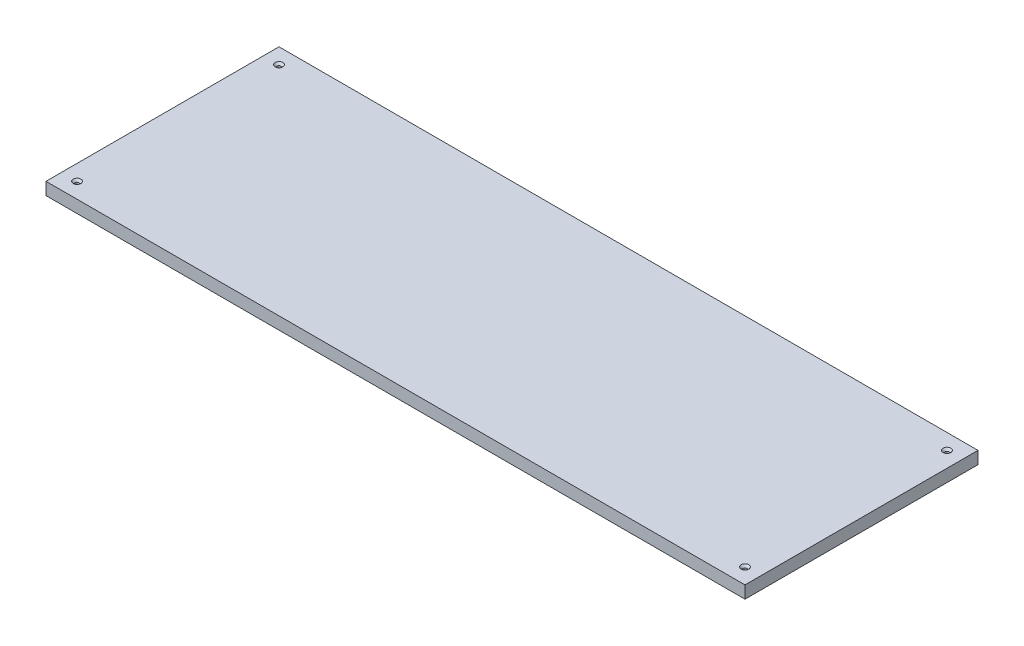
ISO-10303-21;
HEADER;
FILE_DESCRIPTION(('STEP AP214'),'2;1');
FILE_NAME('part.step','',(''),(''),'','','');
FILE_SCHEMA(('AUTOMOTIVE_DESIGN { 1 0 10303 214 1 1 1 1 }'));
ENDSEC;
DATA;
#1=APPLICATION_CONTEXT('core data for automotive mechanical design processes');
#2=APPLICATION_PROTOCOL_DEFINITION('international standard','automotive_design',2000,#1);
#3=PRODUCT_CONTEXT('',#1,'mechanical');
#4=PRODUCT('Part','Part','',(#3));
#5=PRODUCT_RELATED_PRODUCT_CATEGORY('part','',(#4));
#6=PRODUCT_DEFINITION_FORMATION('','',#4);
#7=PRODUCT_DEFINITION_CONTEXT('part definition',#1,'design');
#8=PRODUCT_DEFINITION('design','',#6,#7);
#9=PRODUCT_DEFINITION_SHAPE('','',#8);
#10=(LENGTH_UNIT() NAMED_UNIT(*) SI_UNIT(.MILLI.,.METRE.));
#11=(NAMED_UNIT(*) PLANE_ANGLE_UNIT() SI_UNIT($,.RADIAN.));
#12=(NAMED_UNIT(*) SI_UNIT($,.STERADIAN.) SOLID_ANGLE_UNIT());
#13=UNCERTAINTY_MEASURE_WITH_UNIT(LENGTH_MEASURE(1.E-05),#10,'distance_accuracy_value','');
#14=(GEOMETRIC_REPRESENTATION_CONTEXT(3) GLOBAL_UNCERTAINTY_ASSIGNED_CONTEXT((#13)) GLOBAL_UNIT_ASSIGNED_CONTEXT((#10,
#11,#12)) REPRESENTATION_CONTEXT('',''));
#15=CARTESIAN_POINT('',(0.,0.,0.));
#16=DIRECTION('',(0.,0.,1.));
#17=DIRECTION('',(1.,0.,0.));
#18=AXIS2_PLACEMENT_3D('',#15,#16,#17);
#19=CARTESIAN_POINT('',(450.,16.,150.));
#20=DIRECTION('',(-1.,0.,0.));
#21=DIRECTION('',(0.,0.,1.));
#22=AXIS2_PLACEMENT_3D('',#19,#20,#21);
#23=PLANE('',#22);
#24=DIRECTION('',(0.,0.,-1.));
#25=VECTOR('',#24,1.);
#26=CARTESIAN_POINT('',(450.,0.,150.));
#27=LINE('',#26,#25);
#28=CARTESIAN_POINT('',(450.,0.,150.));
#29=VERTEX_POINT('',#28);
#30=CARTESIAN_POINT('',(450.,0.,-150.));
#31=VERTEX_POINT('',#30);
#32=EDGE_CURVE('E104',#29,#31,#27,.T.);
#33=ORIENTED_EDGE('',*,*,#32,.T.);
#34=DIRECTION('',(0.,-1.,0.));
#35=VECTOR('',#34,1.);
#36=CARTESIAN_POINT('',(450.,16.,-150.));
#37=LINE('',#36,#35);
#38=CARTESIAN_POINT('',(450.,16.,-150.));
#39=VERTEX_POINT('',#38);
#40=EDGE_CURVE('E11',#39,#31,#37,.T.);
#41=ORIENTED_EDGE('',*,*,#40,.F.);
#42=DIRECTION('',(0.,0.,-1.));
#43=VECTOR('',#42,1.);
#44=CARTESIAN_POINT('',(450.,16.,150.));
#45=LINE('',#44,#43);
#46=CARTESIAN_POINT('',(450.,16.,150.));
#47=VERTEX_POINT('',#46);
#48=EDGE_CURVE('E92',#47,#39,#45,.T.);
#49=ORIENTED_EDGE('',*,*,#48,.F.);
#50=DIRECTION('',(0.,-1.,0.));
#51=VECTOR('',#50,1.);
#52=CARTESIAN_POINT('',(450.,16.,150.));
#53=LINE('',#52,#51);
#54=EDGE_CURVE('E100',#47,#29,#53,.T.);
#55=ORIENTED_EDGE('',*,*,#54,.T.);
#56=EDGE_LOOP('',(#33,#41,#49,#55));
#57=FACE_BOUND('',#56,.T.);
#58=ADVANCED_FACE('F41',(#57),#23,.F.);
#59=CARTESIAN_POINT('',(-450.,16.,-150.));
#60=DIRECTION('',(0.,0.,1.));
#61=DIRECTION('',(1.,0.,0.));
#62=AXIS2_PLACEMENT_3D('',#59,#60,#61);
#63=PLANE('',#62);
#64=DIRECTION('',(-1.,0.,0.));
#65=VECTOR('',#64,1.);
#66=CARTESIAN_POINT('',(-450.,0.,-150.));
#67=LINE('',#66,#65);
#68=CARTESIAN_POINT('',(-450.,0.,-150.));
#69=VERTEX_POINT('',#68);
#70=EDGE_CURVE('E96',#31,#69,#67,.T.);
#71=ORIENTED_EDGE('',*,*,#70,.T.);
#72=DIRECTION('',(0.,-1.,0.));
#73=VECTOR('',#72,1.);
#74=CARTESIAN_POINT('',(-450.,16.,-150.));
#75=LINE('',#74,#73);
#76=CARTESIAN_POINT('',(-450.,16.,-150.));
#77=VERTEX_POINT('',#76);
#78=EDGE_CURVE('E49',#77,#69,#75,.T.);
#79=ORIENTED_EDGE('',*,*,#78,.F.);
#80=DIRECTION('',(-1.,0.,0.));
#81=VECTOR('',#80,1.);
#82=CARTESIAN_POINT('',(-450.,16.,-150.));
#83=LINE('',#82,#81);
#84=EDGE_CURVE('E87',#39,#77,#83,.T.);
#85=ORIENTED_EDGE('',*,*,#84,.F.);
#86=ORIENTED_EDGE('',*,*,#40,.T.);
#87=EDGE_LOOP('',(#71,#79,#85,#86));
#88=FACE_BOUND('',#87,.T.);
#89=ADVANCED_FACE('F95',(#88),#63,.F.);
#90=CARTESIAN_POINT('',(-450.,16.,150.));
#91=DIRECTION('',(1.,0.,0.));
#92=DIRECTION('',(0.,0.,-1.));
#93=AXIS2_PLACEMENT_3D('',#90,#91,#92);
#94=PLANE('',#93);
#95=DIRECTION('',(0.,0.,1.));
#96=VECTOR('',#95,1.);
#97=CARTESIAN_POINT('',(-450.,0.,150.));
#98=LINE('',#97,#96);
#99=CARTESIAN_POINT('',(-450.,0.,150.));
#100=VERTEX_POINT('',#99);
#101=EDGE_CURVE('E74',#69,#100,#98,.T.);
#102=ORIENTED_EDGE('',*,*,#101,.T.);
#103=DIRECTION('',(0.,-1.,0.));
#104=VECTOR('',#103,1.);
#105=CARTESIAN_POINT('',(-450.,16.,150.));
#106=LINE('',#105,#104);
#107=CARTESIAN_POINT('',(-450.,16.,150.));
#108=VERTEX_POINT('',#107);
#109=EDGE_CURVE('E97',#108,#100,#106,.T.);
#110=ORIENTED_EDGE('',*,*,#109,.F.);
#111=DIRECTION('',(0.,0.,1.));
#112=VECTOR('',#111,1.);
#113=CARTESIAN_POINT('',(-450.,16.,150.));
#114=LINE('',#113,#112);
#115=EDGE_CURVE('E90',#77,#108,#114,.T.);
#116=ORIENTED_EDGE('',*,*,#115,.F.);
#117=ORIENTED_EDGE('',*,*,#78,.T.);
#118=EDGE_LOOP('',(#102,#110,#116,#117));
#119=FACE_BOUND('',#118,.T.);
#120=ADVANCED_FACE('F98',(#119),#94,.F.);
#121=CARTESIAN_POINT('',(-450.,16.,150.));
#122=DIRECTION('',(0.,0.,-1.));
#123=DIRECTION('',(-1.,0.,0.));
#124=AXIS2_PLACEMENT_3D('',#121,#122,#123);
#125=PLANE('',#124);
#126=DIRECTION('',(1.,0.,0.));
#127=VECTOR('',#126,1.);
#128=CARTESIAN_POINT('',(-450.,0.,150.));
#129=LINE('',#128,#127);
#130=EDGE_CURVE('E80',#100,#29,#129,.T.);
#131=ORIENTED_EDGE('',*,*,#130,.T.);
#132=ORIENTED_EDGE('',*,*,#54,.F.);
#133=DIRECTION('',(1.,0.,0.));
#134=VECTOR('',#133,1.);
#135=CARTESIAN_POINT('',(-450.,16.,150.));
#136=LINE('',#135,#134);
#137=EDGE_CURVE('E57',#108,#47,#136,.T.);
#138=ORIENTED_EDGE('',*,*,#137,.F.);
#139=ORIENTED_EDGE('',*,*,#109,.T.);
#140=EDGE_LOOP('',(#131,#132,#138,#139));
#141=FACE_BOUND('',#140,.T.);
#142=ADVANCED_FACE('F112',(#141),#125,.F.);
#143=CARTESIAN_POINT('',(0.,16.,0.));
#144=DIRECTION('',(0.,-1.,0.));
#145=DIRECTION('',(0.,0.,-1.));
#146=AXIS2_PLACEMENT_3D('',#143,#144,#145);
#147=PLANE('',#146);
#148=CARTESIAN_POINT('',(430.,16.,130.));
#149=DIRECTION('',(0.,1.,0.));
#150=DIRECTION('',(0.,0.,1.));
#151=AXIS2_PLACEMENT_3D('',#148,#149,#150);
#152=CIRCLE('',#151,4.95000000000001);
#153=CARTESIAN_POINT('',(430.,16.,134.95));
#154=VERTEX_POINT('',#153);
#155=EDGE_CURVE('E150',#154,#154,#152,.T.);
#156=ORIENTED_EDGE('',*,*,#155,.F.);
#157=EDGE_LOOP('',(#156));
#158=FACE_BOUND('',#157,.T.);
#159=CARTESIAN_POINT('',(430.,16.,-130.));
#160=DIRECTION('',(0.,1.,0.));
#161=DIRECTION('',(0.,0.,1.));
#162=AXIS2_PLACEMENT_3D('',#159,#160,#161);
#163=CIRCLE('',#162,4.95000000000001);
#164=CARTESIAN_POINT('',(430.,16.,-125.05));
#165=VERTEX_POINT('',#164);
#166=EDGE_CURVE('E141',#165,#165,#163,.T.);
#167=ORIENTED_EDGE('',*,*,#166,.F.);
#168=EDGE_LOOP('',(#167));
#169=FACE_BOUND('',#168,.T.);
#170=CARTESIAN_POINT('',(-430.,16.,130.));
#171=DIRECTION('',(0.,1.,0.));
#172=DIRECTION('',(0.,0.,1.));
#173=AXIS2_PLACEMENT_3D('',#170,#171,#172);
#174=CIRCLE('',#173,4.95000000000001);
#175=CARTESIAN_POINT('',(-430.,16.,134.95));
#176=VERTEX_POINT('',#175);
#177=EDGE_CURVE('E132',#176,#176,#174,.T.);
#178=ORIENTED_EDGE('',*,*,#177,.F.);
#179=EDGE_LOOP('',(#178));
#180=FACE_BOUND('',#179,.T.);
#181=CARTESIAN_POINT('',(-430.,16.,-130.));
#182=DIRECTION('',(0.,1.,0.));
#183=DIRECTION('',(0.,0.,1.));
#184=AXIS2_PLACEMENT_3D('',#181,#182,#183);
#185=CIRCLE('',#184,4.95000000000001);
#186=CARTESIAN_POINT('',(-430.,16.,-125.05));
#187=VERTEX_POINT('',#186);
#188=EDGE_CURVE('E123',#187,#187,#185,.T.);
#189=ORIENTED_EDGE('',*,*,#188,.F.);
#190=EDGE_LOOP('',(#189));
#191=FACE_BOUND('',#190,.T.);
#192=ORIENTED_EDGE('',*,*,#48,.T.);
#193=ORIENTED_EDGE('',*,*,#84,.T.);
#194=ORIENTED_EDGE('',*,*,#115,.T.);
#195=ORIENTED_EDGE('',*,*,#137,.T.);
#196=EDGE_LOOP('',(#192,#193,#194,#195));
#197=FACE_BOUND('',#196,.T.);
#198=ADVANCED_FACE('F88',(#158,#169,#180,#191,#197),#147,.F.);
#199=CARTESIAN_POINT('',(0.,0.,0.));
#200=DIRECTION('',(0.,-1.,0.));
#201=DIRECTION('',(0.,0.,-1.));
#202=AXIS2_PLACEMENT_3D('',#199,#200,#201);
#203=PLANE('',#202);
#204=CARTESIAN_POINT('',(430.,0.,130.));
#205=DIRECTION('',(0.,1.,0.));
#206=DIRECTION('',(0.,0.,1.));
#207=AXIS2_PLACEMENT_3D('',#204,#205,#206);
#208=CIRCLE('',#207,2.24999999999997);
#209=CARTESIAN_POINT('',(430.,0.,132.25));
#210=VERTEX_POINT('',#209);
#211=EDGE_CURVE('E144',#210,#210,#208,.T.);
#212=ORIENTED_EDGE('',*,*,#211,.T.);
#213=EDGE_LOOP('',(#212));
#214=FACE_BOUND('',#213,.T.);
#215=CARTESIAN_POINT('',(430.,0.,-130.));
#216=DIRECTION('',(0.,1.,0.));
#217=DIRECTION('',(0.,0.,1.));
#218=AXIS2_PLACEMENT_3D('',#215,#216,#217);
#219=CIRCLE('',#218,2.24999999999997);
#220=CARTESIAN_POINT('',(430.,0.,-127.75));
#221=VERTEX_POINT('',#220);
#222=EDGE_CURVE('E135',#221,#221,#219,.T.);
#223=ORIENTED_EDGE('',*,*,#222,.T.);
#224=EDGE_LOOP('',(#223));
#225=FACE_BOUND('',#224,.T.);
#226=CARTESIAN_POINT('',(-430.,0.,130.));
#227=DIRECTION('',(0.,1.,0.));
#228=DIRECTION('',(0.,0.,1.));
#229=AXIS2_PLACEMENT_3D('',#226,#227,#228);
#230=CIRCLE('',#229,2.24999999999997);
#231=CARTESIAN_POINT('',(-430.,0.,132.25));
#232=VERTEX_POINT('',#231);
#233=EDGE_CURVE('E126',#232,#232,#230,.T.);
#234=ORIENTED_EDGE('',*,*,#233,.T.);
#235=EDGE_LOOP('',(#234));
#236=FACE_BOUND('',#235,.T.);
#237=CARTESIAN_POINT('',(-430.,0.,-130.));
#238=DIRECTION('',(0.,1.,0.));
#239=DIRECTION('',(0.,0.,1.));
#240=AXIS2_PLACEMENT_3D('',#237,#238,#239);
#241=CIRCLE('',#240,2.24999999999997);
#242=CARTESIAN_POINT('',(-430.,0.,-127.75));
#243=VERTEX_POINT('',#242);
#244=EDGE_CURVE('E107',#243,#243,#241,.T.);
#245=ORIENTED_EDGE('',*,*,#244,.T.);
#246=EDGE_LOOP('',(#245));
#247=FACE_BOUND('',#246,.T.);
#248=ORIENTED_EDGE('',*,*,#32,.F.);
#249=ORIENTED_EDGE('',*,*,#130,.F.);
#250=ORIENTED_EDGE('',*,*,#101,.F.);
#251=ORIENTED_EDGE('',*,*,#70,.F.);
#252=EDGE_LOOP('',(#248,#249,#250,#251));
#253=FACE_BOUND('',#252,.T.);
#254=ADVANCED_FACE('F115',(#214,#225,#236,#247,#253),#203,.T.);
#255=CARTESIAN_POINT('',(-430.,16.,-130.));
#256=DIRECTION('',(0.,1.,0.));
#257=DIRECTION('',(0.,0.,1.));
#258=AXIS2_PLACEMENT_3D('',#255,#256,#257);
#259=CYLINDRICAL_SURFACE('',#258,2.24999999999997);
#260=ORIENTED_EDGE('',*,*,#244,.F.);
#261=EDGE_LOOP('',(#260));
#262=FACE_BOUND('',#261,.T.);
#263=CARTESIAN_POINT('',(-430.,13.3926403080209,-130.));
#264=DIRECTION('',(0.,1.,0.));
#265=DIRECTION('',(0.,0.,1.));
#266=AXIS2_PLACEMENT_3D('',#263,#264,#265);
#267=CIRCLE('',#266,2.24999999999997);
#268=CARTESIAN_POINT('',(-430.,13.3926403080209,-127.75));
#269=VERTEX_POINT('',#268);
#270=EDGE_CURVE('E120',#269,#269,#267,.T.);
#271=ORIENTED_EDGE('',*,*,#270,.T.);
#272=EDGE_LOOP('',(#271));
#273=FACE_BOUND('',#272,.T.);
#274=ADVANCED_FACE('F168',(#262,#273),#259,.F.);
#275=CARTESIAN_POINT('',(-430.,16.,-130.));
#276=DIRECTION('',(0.,1.,0.));
#277=DIRECTION('',(0.,0.,1.));
#278=AXIS2_PLACEMENT_3D('',#275,#276,#277);
#279=CONICAL_SURFACE('',#278,4.95000000000001,0.802851455917398);
#280=ORIENTED_EDGE('',*,*,#270,.F.);
#281=EDGE_LOOP('',(#280));
#282=FACE_BOUND('',#281,.T.);
#283=ORIENTED_EDGE('',*,*,#188,.T.);
#284=EDGE_LOOP('',(#283));
#285=FACE_BOUND('',#284,.T.);
#286=ADVANCED_FACE('F165',(#282,#285),#279,.F.);
#287=CARTESIAN_POINT('',(-430.,16.,130.));
#288=DIRECTION('',(0.,1.,0.));
#289=DIRECTION('',(0.,0.,1.));
#290=AXIS2_PLACEMENT_3D('',#287,#288,#289);
#291=CYLINDRICAL_SURFACE('',#290,2.24999999999997);
#292=ORIENTED_EDGE('',*,*,#233,.F.);
#293=EDGE_LOOP('',(#292));
#294=FACE_BOUND('',#293,.T.);
#295=CARTESIAN_POINT('',(-430.,13.3926403080209,130.));
#296=DIRECTION('',(0.,1.,0.));
#297=DIRECTION('',(0.,0.,1.));
#298=AXIS2_PLACEMENT_3D('',#295,#296,#297);
#299=CIRCLE('',#298,2.24999999999997);
#300=CARTESIAN_POINT('',(-430.,13.3926403080209,132.25));
#301=VERTEX_POINT('',#300);
#302=EDGE_CURVE('E129',#301,#301,#299,.T.);
#303=ORIENTED_EDGE('',*,*,#302,.T.);
#304=EDGE_LOOP('',(#303));
#305=FACE_BOUND('',#304,.T.);
#306=ADVANCED_FACE('F167',(#294,#305),#291,.F.);
#307=CARTESIAN_POINT('',(-430.,16.,130.));
#308=DIRECTION('',(0.,1.,0.));
#309=DIRECTION('',(0.,0.,1.));
#310=AXIS2_PLACEMENT_3D('',#307,#308,#309);
#311=CONICAL_SURFACE('',#310,4.95000000000001,0.802851455917398);
#312=ORIENTED_EDGE('',*,*,#302,.F.);
#313=EDGE_LOOP('',(#312));
#314=FACE_BOUND('',#313,.T.);
#315=ORIENTED_EDGE('',*,*,#177,.T.);
#316=EDGE_LOOP('',(#315));
#317=FACE_BOUND('',#316,.T.);
#318=ADVANCED_FACE('F175',(#314,#317),#311,.F.);
#319=CARTESIAN_POINT('',(430.,16.,-130.));
#320=DIRECTION('',(0.,1.,0.));
#321=DIRECTION('',(0.,0.,1.));
#322=AXIS2_PLACEMENT_3D('',#319,#320,#321);
#323=CYLINDRICAL_SURFACE('',#322,2.24999999999997);
#324=ORIENTED_EDGE('',*,*,#222,.F.);
#325=EDGE_LOOP('',(#324));
#326=FACE_BOUND('',#325,.T.);
#327=CARTESIAN_POINT('',(430.,13.3926403080209,-130.));
#328=DIRECTION('',(0.,1.,0.));
#329=DIRECTION('',(0.,0.,1.));
#330=AXIS2_PLACEMENT_3D('',#327,#328,#329);
#331=CIRCLE('',#330,2.24999999999997);
#332=CARTESIAN_POINT('',(430.,13.3926403080209,-127.75));
#333=VERTEX_POINT('',#332);
#334=EDGE_CURVE('E138',#333,#333,#331,.T.);
#335=ORIENTED_EDGE('',*,*,#334,.T.);
#336=EDGE_LOOP('',(#335));
#337=FACE_BOUND('',#336,.T.);
#338=ADVANCED_FACE('F209',(#326,#337),#323,.F.);
#339=CARTESIAN_POINT('',(430.,16.,-130.));
#340=DIRECTION('',(0.,1.,0.));
#341=DIRECTION('',(0.,0.,1.));
#342=AXIS2_PLACEMENT_3D('',#339,#340,#341);
#343=CONICAL_SURFACE('',#342,4.95000000000001,0.802851455917398);
#344=ORIENTED_EDGE('',*,*,#334,.F.);
#345=EDGE_LOOP('',(#344));
#346=FACE_BOUND('',#345,.T.);
#347=ORIENTED_EDGE('',*,*,#166,.T.);
#348=EDGE_LOOP('',(#347));
#349=FACE_BOUND('',#348,.T.);
#350=ADVANCED_FACE('F214',(#346,#349),#343,.F.);
#351=CARTESIAN_POINT('',(430.,16.,130.));
#352=DIRECTION('',(0.,1.,0.));
#353=DIRECTION('',(0.,0.,1.));
#354=AXIS2_PLACEMENT_3D('',#351,#352,#353);
#355=CYLINDRICAL_SURFACE('',#354,2.24999999999997);
#356=ORIENTED_EDGE('',*,*,#211,.F.);
#357=EDGE_LOOP('',(#356));
#358=FACE_BOUND('',#357,.T.);
#359=CARTESIAN_POINT('',(430.,13.3926403080209,130.));
#360=DIRECTION('',(0.,1.,0.));
#361=DIRECTION('',(0.,0.,1.));
#362=AXIS2_PLACEMENT_3D('',#359,#360,#361);
#363=CIRCLE('',#362,2.24999999999997);
#364=CARTESIAN_POINT('',(430.,13.3926403080209,132.25));
#365=VERTEX_POINT('',#364);
#366=EDGE_CURVE('E147',#365,#365,#363,.T.);
#367=ORIENTED_EDGE('',*,*,#366,.T.);
#368=EDGE_LOOP('',(#367));
#369=FACE_BOUND('',#368,.T.);
#370=ADVANCED_FACE('F220',(#358,#369),#355,.F.);
#371=CARTESIAN_POINT('',(430.,16.,130.));
#372=DIRECTION('',(0.,1.,0.));
#373=DIRECTION('',(0.,0.,1.));
#374=AXIS2_PLACEMENT_3D('',#371,#372,#373);
#375=CONICAL_SURFACE('',#374,4.95000000000001,0.802851455917398);
#376=ORIENTED_EDGE('',*,*,#366,.F.);
#377=EDGE_LOOP('',(#376));
#378=FACE_BOUND('',#377,.T.);
#379=ORIENTED_EDGE('',*,*,#155,.T.);
#380=EDGE_LOOP('',(#379));
#381=FACE_BOUND('',#380,.T.);
#382=ADVANCED_FACE('F154',(#378,#381),#375,.F.);
#383=CLOSED_SHELL('',(#58,#89,#120,#142,#198,#254,#274,#286,#306,#318,#338,#350,#370,#382));
#384=MANIFOLD_SOLID_BREP('B2',#383);
#385=ADVANCED_BREP_SHAPE_REPRESENTATION('',(#18,#384),#14);
#386=SHAPE_DEFINITION_REPRESENTATION(#9,#385);
ENDSEC;
END-ISO-10303-21;
